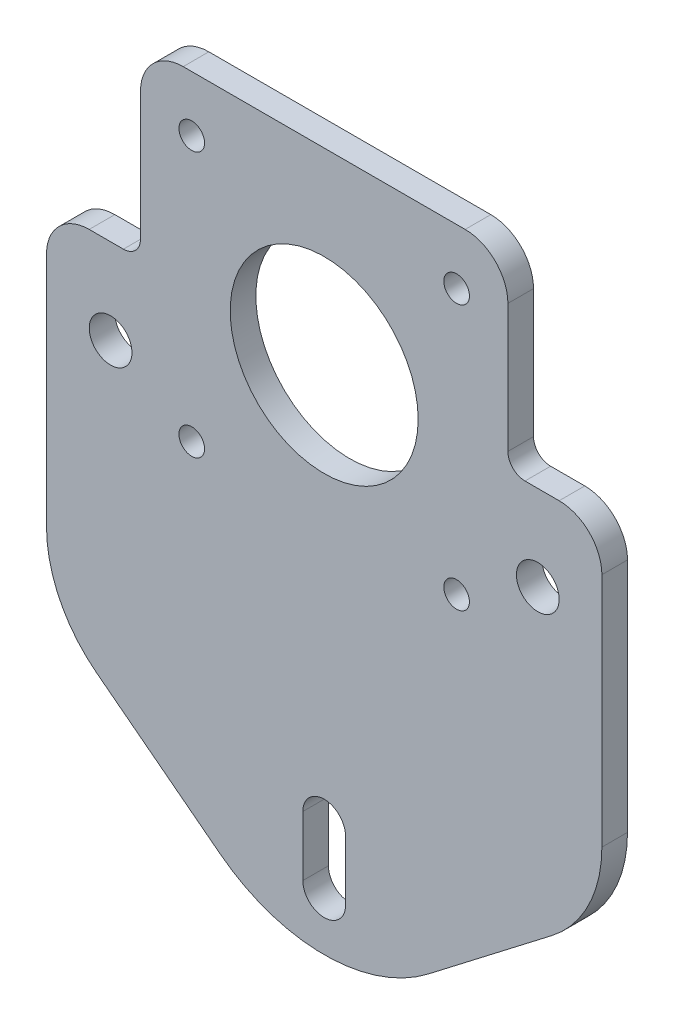
ISO-10303-21;
HEADER;
FILE_DESCRIPTION(('STEP AP214'),'2;1');
FILE_NAME('part.step','',(''),(''),'','','');
FILE_SCHEMA(('AUTOMOTIVE_DESIGN { 1 0 10303 214 1 1 1 1 }'));
ENDSEC;
DATA;
#1=APPLICATION_CONTEXT('core data for automotive mechanical design processes');
#2=APPLICATION_PROTOCOL_DEFINITION('international standard','automotive_design',2000,#1);
#3=PRODUCT_CONTEXT('',#1,'mechanical');
#4=PRODUCT('Part','Part','',(#3));
#5=PRODUCT_RELATED_PRODUCT_CATEGORY('part','',(#4));
#6=PRODUCT_DEFINITION_FORMATION('','',#4);
#7=PRODUCT_DEFINITION_CONTEXT('part definition',#1,'design');
#8=PRODUCT_DEFINITION('design','',#6,#7);
#9=PRODUCT_DEFINITION_SHAPE('','',#8);
#10=(LENGTH_UNIT() NAMED_UNIT(*) SI_UNIT(.MILLI.,.METRE.));
#11=(NAMED_UNIT(*) PLANE_ANGLE_UNIT() SI_UNIT($,.RADIAN.));
#12=(NAMED_UNIT(*) SI_UNIT($,.STERADIAN.) SOLID_ANGLE_UNIT());
#13=UNCERTAINTY_MEASURE_WITH_UNIT(LENGTH_MEASURE(1.E-05),#10,'distance_accuracy_value','');
#14=(GEOMETRIC_REPRESENTATION_CONTEXT(3) GLOBAL_UNCERTAINTY_ASSIGNED_CONTEXT((#13)) GLOBAL_UNIT_ASSIGNED_CONTEXT((#10,
#11,#12)) REPRESENTATION_CONTEXT('',''));
#15=CARTESIAN_POINT('',(0.,0.,0.));
#16=DIRECTION('',(0.,0.,1.));
#17=DIRECTION('',(1.,0.,0.));
#18=AXIS2_PLACEMENT_3D('',#15,#16,#17);
#19=CARTESIAN_POINT('',(-32.5,30.,3.));
#20=DIRECTION('',(0.,-1.,0.));
#21=DIRECTION('',(0.,0.,-1.));
#22=AXIS2_PLACEMENT_3D('',#19,#20,#21);
#23=PLANE('',#22);
#24=DIRECTION('',(-1.,0.,0.));
#25=VECTOR('',#24,1.);
#26=CARTESIAN_POINT('',(-32.5,30.,3.));
#27=LINE('',#26,#25);
#28=CARTESIAN_POINT('',(-23.5,30.,3.));
#29=VERTEX_POINT('',#28);
#30=CARTESIAN_POINT('',(-27.5,30.,3.));
#31=VERTEX_POINT('',#30);
#32=EDGE_CURVE('E247',#29,#31,#27,.T.);
#33=ORIENTED_EDGE('',*,*,#32,.F.);
#34=DIRECTION('',(0.,0.,1.));
#35=VECTOR('',#34,1.);
#36=CARTESIAN_POINT('',(-23.5,30.,0.));
#37=LINE('',#36,#35);
#38=CARTESIAN_POINT('',(-23.5,30.,0.));
#39=VERTEX_POINT('',#38);
#40=EDGE_CURVE('E280',#29,#39,#37,.F.);
#41=ORIENTED_EDGE('',*,*,#40,.T.);
#42=DIRECTION('',(-1.,0.,0.));
#43=VECTOR('',#42,1.);
#44=CARTESIAN_POINT('',(-32.5,30.,0.));
#45=LINE('',#44,#43);
#46=CARTESIAN_POINT('',(-27.5,30.,0.));
#47=VERTEX_POINT('',#46);
#48=EDGE_CURVE('E263',#39,#47,#45,.T.);
#49=ORIENTED_EDGE('',*,*,#48,.T.);
#50=DIRECTION('',(0.,0.,-1.));
#51=VECTOR('',#50,1.);
#52=CARTESIAN_POINT('',(-27.5,30.,3.));
#53=LINE('',#52,#51);
#54=EDGE_CURVE('E278',#47,#31,#53,.F.);
#55=ORIENTED_EDGE('',*,*,#54,.T.);
#56=EDGE_LOOP('',(#33,#41,#49,#55));
#57=FACE_BOUND('',#56,.T.);
#58=ADVANCED_FACE('F36',(#57),#23,.F.);
#59=CARTESIAN_POINT('',(27.5,30.,0.));
#60=VERTEX_POINT('',#59);
#61=CARTESIAN_POINT('',(23.5,30.,0.));
#62=VERTEX_POINT('',#61);
#63=EDGE_CURVE('E264',#60,#62,#45,.T.);
#64=ORIENTED_EDGE('',*,*,#63,.T.);
#65=DIRECTION('',(0.,0.,1.));
#66=VECTOR('',#65,1.);
#67=CARTESIAN_POINT('',(23.5,30.,3.));
#68=LINE('',#67,#66);
#69=CARTESIAN_POINT('',(23.5,30.,3.));
#70=VERTEX_POINT('',#69);
#71=EDGE_CURVE('E285',#62,#70,#68,.T.);
#72=ORIENTED_EDGE('',*,*,#71,.T.);
#73=CARTESIAN_POINT('',(27.5,30.,3.));
#74=VERTEX_POINT('',#73);
#75=EDGE_CURVE('E249',#74,#70,#27,.T.);
#76=ORIENTED_EDGE('',*,*,#75,.F.);
#77=DIRECTION('',(0.,0.,-1.));
#78=VECTOR('',#77,1.);
#79=CARTESIAN_POINT('',(27.5,30.,3.));
#80=LINE('',#79,#78);
#81=EDGE_CURVE('E282',#74,#60,#80,.T.);
#82=ORIENTED_EDGE('',*,*,#81,.T.);
#83=EDGE_LOOP('',(#64,#72,#76,#82));
#84=FACE_BOUND('',#83,.T.);
#85=ADVANCED_FACE('F372',(#84),#23,.F.);
#86=CARTESIAN_POINT('',(0.,0.,3.));
#87=DIRECTION('',(0.,0.,1.));
#88=DIRECTION('',(1.,0.,0.));
#89=AXIS2_PLACEMENT_3D('',#86,#87,#88);
#90=PLANE('',#89);
#91=CARTESIAN_POINT('',(15.5,14.5,3.));
#92=DIRECTION('',(0.,0.,1.));
#93=DIRECTION('',(1.,0.,0.));
#94=AXIS2_PLACEMENT_3D('',#91,#92,#93);
#95=CIRCLE('',#94,1.5);
#96=CARTESIAN_POINT('',(17.,14.5,3.));
#97=VERTEX_POINT('',#96);
#98=EDGE_CURVE('E458',#97,#97,#95,.T.);
#99=ORIENTED_EDGE('',*,*,#98,.F.);
#100=EDGE_LOOP('',(#99));
#101=FACE_BOUND('',#100,.T.);
#102=CARTESIAN_POINT('',(-15.5,14.5,3.));
#103=DIRECTION('',(0.,0.,1.));
#104=DIRECTION('',(1.,0.,0.));
#105=AXIS2_PLACEMENT_3D('',#102,#103,#104);
#106=CIRCLE('',#105,1.5);
#107=CARTESIAN_POINT('',(-14.,14.5,3.));
#108=VERTEX_POINT('',#107);
#109=EDGE_CURVE('E452',#108,#108,#106,.T.);
#110=ORIENTED_EDGE('',*,*,#109,.F.);
#111=EDGE_LOOP('',(#110));
#112=FACE_BOUND('',#111,.T.);
#113=CARTESIAN_POINT('',(0.,30.,3.));
#114=DIRECTION('',(0.,0.,1.));
#115=DIRECTION('',(1.,0.,0.));
#116=AXIS2_PLACEMENT_3D('',#113,#114,#115);
#117=CIRCLE('',#116,11.);
#118=CARTESIAN_POINT('',(11.,30.,3.));
#119=VERTEX_POINT('',#118);
#120=EDGE_CURVE('E361',#119,#119,#117,.T.);
#121=ORIENTED_EDGE('',*,*,#120,.F.);
#122=EDGE_LOOP('',(#121));
#123=FACE_BOUND('',#122,.T.);
#124=CARTESIAN_POINT('',(25.,20.,3.));
#125=DIRECTION('',(0.,0.,1.));
#126=DIRECTION('',(1.,0.,0.));
#127=AXIS2_PLACEMENT_3D('',#124,#125,#126);
#128=CIRCLE('',#127,2.5);
#129=CARTESIAN_POINT('',(27.5,20.,3.));
#130=VERTEX_POINT('',#129);
#131=EDGE_CURVE('E238',#130,#130,#128,.T.);
#132=ORIENTED_EDGE('',*,*,#131,.F.);
#133=EDGE_LOOP('',(#132));
#134=FACE_BOUND('',#133,.T.);
#135=DIRECTION('',(0.792623989104599,-0.609710760849693,0.));
#136=VECTOR('',#135,1.);
#137=CARTESIAN_POINT('',(0.,-35.,3.));
#138=LINE('',#137,#136);
#139=CARTESIAN_POINT('',(-26.6456614127454,-14.5033373748112,3.));
#140=VERTEX_POINT('',#139);
#141=CARTESIAN_POINT('',(-12.1942152169939,-25.6198344484662,3.));
#142=VERTEX_POINT('',#141);
#143=EDGE_CURVE('E254',#140,#142,#138,.T.);
#144=ORIENTED_EDGE('',*,*,#143,.T.);
#145=CARTESIAN_POINT('',(0.,-9.76735466637425,3.));
#146=DIRECTION('',(0.,0.,1.));
#147=DIRECTION('',(1.,0.,0.));
#148=AXIS2_PLACEMENT_3D('',#145,#146,#147);
#149=CIRCLE('',#148,20.);
#150=CARTESIAN_POINT('',(12.1942152169939,-25.6198344484662,3.));
#151=VERTEX_POINT('',#150);
#152=EDGE_CURVE('E328',#142,#151,#149,.T.);
#153=ORIENTED_EDGE('',*,*,#152,.T.);
#154=DIRECTION('',(0.792623989104599,0.609710760849693,0.));
#155=VECTOR('',#154,1.);
#156=CARTESIAN_POINT('',(32.5,-9.99999999999994,3.));
#157=LINE('',#156,#155);
#158=CARTESIAN_POINT('',(26.6456614127454,-14.5033373748112,3.));
#159=VERTEX_POINT('',#158);
#160=EDGE_CURVE('E257',#151,#159,#157,.T.);
#161=ORIENTED_EDGE('',*,*,#160,.T.);
#162=CARTESIAN_POINT('',(17.5,-2.61397753824219,3.));
#163=DIRECTION('',(0.,0.,1.));
#164=DIRECTION('',(1.,0.,0.));
#165=AXIS2_PLACEMENT_3D('',#162,#163,#164);
#166=CIRCLE('',#165,15.);
#167=CARTESIAN_POINT('',(32.5,-2.61397753824219,3.));
#168=VERTEX_POINT('',#167);
#169=EDGE_CURVE('E326',#159,#168,#166,.T.);
#170=ORIENTED_EDGE('',*,*,#169,.T.);
#171=DIRECTION('',(0.,1.,0.));
#172=VECTOR('',#171,1.);
#173=CARTESIAN_POINT('',(32.5,30.,3.));
#174=LINE('',#173,#172);
#175=CARTESIAN_POINT('',(32.5,25.,3.));
#176=VERTEX_POINT('',#175);
#177=EDGE_CURVE('E244',#168,#176,#174,.T.);
#178=ORIENTED_EDGE('',*,*,#177,.T.);
#179=CARTESIAN_POINT('',(27.5,25.,3.));
#180=DIRECTION('',(0.,0.,1.));
#181=DIRECTION('',(1.,0.,0.));
#182=AXIS2_PLACEMENT_3D('',#179,#180,#181);
#183=CIRCLE('',#182,5.);
#184=EDGE_CURVE('E317',#176,#74,#183,.T.);
#185=ORIENTED_EDGE('',*,*,#184,.T.);
#186=ORIENTED_EDGE('',*,*,#75,.T.);
#187=CARTESIAN_POINT('',(23.5,32.,3.));
#188=DIRECTION('',(0.,0.,1.));
#189=DIRECTION('',(1.,0.,0.));
#190=AXIS2_PLACEMENT_3D('',#187,#188,#189);
#191=CIRCLE('',#190,2.);
#192=CARTESIAN_POINT('',(21.5,32.,3.));
#193=VERTEX_POINT('',#192);
#194=EDGE_CURVE('E44',#70,#193,#191,.F.);
#195=ORIENTED_EDGE('',*,*,#194,.T.);
#196=DIRECTION('',(0.,1.,0.));
#197=VECTOR('',#196,1.);
#198=CARTESIAN_POINT('',(21.5,0.,3.));
#199=LINE('',#198,#197);
#200=CARTESIAN_POINT('',(21.5,47.,3.));
#201=VERTEX_POINT('',#200);
#202=EDGE_CURVE('E350',#193,#201,#199,.T.);
#203=ORIENTED_EDGE('',*,*,#202,.T.);
#204=CARTESIAN_POINT('',(16.5,47.,3.));
#205=DIRECTION('',(0.,0.,1.));
#206=DIRECTION('',(1.,0.,0.));
#207=AXIS2_PLACEMENT_3D('',#204,#205,#206);
#208=CIRCLE('',#207,5.);
#209=CARTESIAN_POINT('',(16.5,52.,3.));
#210=VERTEX_POINT('',#209);
#211=EDGE_CURVE('E322',#201,#210,#208,.T.);
#212=ORIENTED_EDGE('',*,*,#211,.T.);
#213=DIRECTION('',(1.,0.,0.));
#214=VECTOR('',#213,1.);
#215=CARTESIAN_POINT('',(0.,52.,3.));
#216=LINE('',#215,#214);
#217=CARTESIAN_POINT('',(-16.5,52.,3.));
#218=VERTEX_POINT('',#217);
#219=EDGE_CURVE('E360',#218,#210,#216,.T.);
#220=ORIENTED_EDGE('',*,*,#219,.F.);
#221=CARTESIAN_POINT('',(-16.5,47.,3.));
#222=DIRECTION('',(0.,0.,1.));
#223=DIRECTION('',(1.,0.,0.));
#224=AXIS2_PLACEMENT_3D('',#221,#222,#223);
#225=CIRCLE('',#224,5.);
#226=CARTESIAN_POINT('',(-21.5,47.,3.));
#227=VERTEX_POINT('',#226);
#228=EDGE_CURVE('E320',#218,#227,#225,.T.);
#229=ORIENTED_EDGE('',*,*,#228,.T.);
#230=DIRECTION('',(0.,1.,0.));
#231=VECTOR('',#230,1.);
#232=CARTESIAN_POINT('',(-21.5,0.,3.));
#233=LINE('',#232,#231);
#234=CARTESIAN_POINT('',(-21.5,32.,3.));
#235=VERTEX_POINT('',#234);
#236=EDGE_CURVE('E450',#235,#227,#233,.T.);
#237=ORIENTED_EDGE('',*,*,#236,.F.);
#238=CARTESIAN_POINT('',(-23.5,32.,3.));
#239=DIRECTION('',(0.,0.,1.));
#240=DIRECTION('',(1.,0.,0.));
#241=AXIS2_PLACEMENT_3D('',#238,#239,#240);
#242=CIRCLE('',#241,2.);
#243=EDGE_CURVE('E344',#235,#29,#242,.F.);
#244=ORIENTED_EDGE('',*,*,#243,.T.);
#245=ORIENTED_EDGE('',*,*,#32,.T.);
#246=CARTESIAN_POINT('',(-27.5,25.,3.));
#247=DIRECTION('',(0.,0.,1.));
#248=DIRECTION('',(1.,0.,0.));
#249=AXIS2_PLACEMENT_3D('',#246,#247,#248);
#250=CIRCLE('',#249,5.);
#251=CARTESIAN_POINT('',(-32.5,25.,3.));
#252=VERTEX_POINT('',#251);
#253=EDGE_CURVE('E58',#31,#252,#250,.T.);
#254=ORIENTED_EDGE('',*,*,#253,.T.);
#255=DIRECTION('',(0.,-1.,0.));
#256=VECTOR('',#255,1.);
#257=CARTESIAN_POINT('',(-32.5,-9.99999999999994,3.));
#258=LINE('',#257,#256);
#259=CARTESIAN_POINT('',(-32.5,-2.61397753824219,3.));
#260=VERTEX_POINT('',#259);
#261=EDGE_CURVE('E252',#252,#260,#258,.T.);
#262=ORIENTED_EDGE('',*,*,#261,.T.);
#263=CARTESIAN_POINT('',(-17.5,-2.61397753824219,3.));
#264=DIRECTION('',(0.,0.,1.));
#265=DIRECTION('',(1.,0.,0.));
#266=AXIS2_PLACEMENT_3D('',#263,#264,#265);
#267=CIRCLE('',#266,15.);
#268=EDGE_CURVE('E324',#260,#140,#267,.T.);
#269=ORIENTED_EDGE('',*,*,#268,.T.);
#270=EDGE_LOOP('',(#144,#153,#161,#170,#178,#185,#186,#195,#203,#212,#220,#229,#237,#244,#245,
#254,#262,#269));
#271=FACE_BOUND('',#270,.T.);
#272=CARTESIAN_POINT('',(-25.,20.,3.));
#273=DIRECTION('',(0.,0.,1.));
#274=DIRECTION('',(1.,0.,0.));
#275=AXIS2_PLACEMENT_3D('',#272,#273,#274);
#276=CIRCLE('',#275,2.5);
#277=CARTESIAN_POINT('',(-22.5,20.,3.));
#278=VERTEX_POINT('',#277);
#279=EDGE_CURVE('E232',#278,#278,#276,.T.);
#280=ORIENTED_EDGE('',*,*,#279,.F.);
#281=EDGE_LOOP('',(#280));
#282=FACE_BOUND('',#281,.T.);
#283=DIRECTION('',(0.,-1.,0.));
#284=VECTOR('',#283,1.);
#285=CARTESIAN_POINT('',(-2.50000000000698,-16.5,3.));
#286=LINE('',#285,#284);
#287=CARTESIAN_POINT('',(-2.50000000000698,-16.5,3.));
#288=VERTEX_POINT('',#287);
#289=CARTESIAN_POINT('',(-2.50000000000698,-23.5,3.));
#290=VERTEX_POINT('',#289);
#291=EDGE_CURVE('E197',#288,#290,#286,.T.);
#292=ORIENTED_EDGE('',*,*,#291,.F.);
#293=CARTESIAN_POINT('',(-6.97987588455585E-12,-16.5000000000001,3.));
#294=DIRECTION('',(0.,0.,1.));
#295=DIRECTION('',(1.,0.,0.));
#296=AXIS2_PLACEMENT_3D('',#293,#294,#295);
#297=CIRCLE('',#296,2.5);
#298=CARTESIAN_POINT('',(2.49999999999302,-16.5,3.));
#299=VERTEX_POINT('',#298);
#300=EDGE_CURVE('E187',#299,#288,#297,.T.);
#301=ORIENTED_EDGE('',*,*,#300,.F.);
#302=DIRECTION('',(0.,1.,0.));
#303=VECTOR('',#302,1.);
#304=CARTESIAN_POINT('',(2.49999999999302,-16.5,3.));
#305=LINE('',#304,#303);
#306=CARTESIAN_POINT('',(2.49999999999302,-23.5,3.));
#307=VERTEX_POINT('',#306);
#308=EDGE_CURVE('E214',#307,#299,#305,.T.);
#309=ORIENTED_EDGE('',*,*,#308,.F.);
#310=CARTESIAN_POINT('',(-6.98116176369495E-12,-23.5,3.));
#311=DIRECTION('',(0.,0.,1.));
#312=DIRECTION('',(1.,0.,0.));
#313=AXIS2_PLACEMENT_3D('',#310,#311,#312);
#314=CIRCLE('',#313,2.5);
#315=EDGE_CURVE('E212',#290,#307,#314,.T.);
#316=ORIENTED_EDGE('',*,*,#315,.F.);
#317=EDGE_LOOP('',(#292,#301,#309,#316));
#318=FACE_BOUND('',#317,.T.);
#319=CARTESIAN_POINT('',(15.5,45.5,3.));
#320=DIRECTION('',(0.,0.,1.));
#321=DIRECTION('',(1.,0.,0.));
#322=AXIS2_PLACEMENT_3D('',#319,#320,#321);
#323=CIRCLE('',#322,1.5);
#324=CARTESIAN_POINT('',(17.,45.5,3.));
#325=VERTEX_POINT('',#324);
#326=EDGE_CURVE('E440',#325,#325,#323,.T.);
#327=ORIENTED_EDGE('',*,*,#326,.F.);
#328=EDGE_LOOP('',(#327));
#329=FACE_BOUND('',#328,.T.);
#330=CARTESIAN_POINT('',(-15.5,45.5,3.));
#331=DIRECTION('',(0.,0.,1.));
#332=DIRECTION('',(1.,0.,0.));
#333=AXIS2_PLACEMENT_3D('',#330,#331,#332);
#334=CIRCLE('',#333,1.5);
#335=CARTESIAN_POINT('',(-14.,45.5,3.));
#336=VERTEX_POINT('',#335);
#337=EDGE_CURVE('E443',#336,#336,#334,.T.);
#338=ORIENTED_EDGE('',*,*,#337,.F.);
#339=EDGE_LOOP('',(#338));
#340=FACE_BOUND('',#339,.T.);
#341=ADVANCED_FACE('F209',(#101,#112,#123,#134,#271,#282,#318,#329,#340),#90,.T.);
#342=CARTESIAN_POINT('',(0.,0.,0.));
#343=DIRECTION('',(0.,0.,1.));
#344=DIRECTION('',(1.,0.,0.));
#345=AXIS2_PLACEMENT_3D('',#342,#343,#344);
#346=PLANE('',#345);
#347=CARTESIAN_POINT('',(15.5,14.5,0.));
#348=DIRECTION('',(0.,0.,1.));
#349=DIRECTION('',(1.,0.,0.));
#350=AXIS2_PLACEMENT_3D('',#347,#348,#349);
#351=CIRCLE('',#350,1.5);
#352=CARTESIAN_POINT('',(17.,14.5,0.));
#353=VERTEX_POINT('',#352);
#354=EDGE_CURVE('E444',#353,#353,#351,.T.);
#355=ORIENTED_EDGE('',*,*,#354,.T.);
#356=EDGE_LOOP('',(#355));
#357=FACE_BOUND('',#356,.T.);
#358=CARTESIAN_POINT('',(-15.5,14.5,0.));
#359=DIRECTION('',(0.,0.,1.));
#360=DIRECTION('',(1.,0.,0.));
#361=AXIS2_PLACEMENT_3D('',#358,#359,#360);
#362=CIRCLE('',#361,1.5);
#363=CARTESIAN_POINT('',(-14.,14.5,0.));
#364=VERTEX_POINT('',#363);
#365=EDGE_CURVE('E455',#364,#364,#362,.T.);
#366=ORIENTED_EDGE('',*,*,#365,.T.);
#367=EDGE_LOOP('',(#366));
#368=FACE_BOUND('',#367,.T.);
#369=DIRECTION('',(0.792623989104599,0.609710760849693,0.));
#370=VECTOR('',#369,1.);
#371=CARTESIAN_POINT('',(32.5,-9.99999999999994,0.));
#372=LINE('',#371,#370);
#373=CARTESIAN_POINT('',(12.1942152169939,-25.6198344484662,0.));
#374=VERTEX_POINT('',#373);
#375=CARTESIAN_POINT('',(26.6456614127454,-14.5033373748112,0.));
#376=VERTEX_POINT('',#375);
#377=EDGE_CURVE('E248',#374,#376,#372,.T.);
#378=ORIENTED_EDGE('',*,*,#377,.F.);
#379=CARTESIAN_POINT('',(0.,-9.76735466637425,0.));
#380=DIRECTION('',(0.,0.,1.));
#381=DIRECTION('',(1.,0.,0.));
#382=AXIS2_PLACEMENT_3D('',#379,#380,#381);
#383=CIRCLE('',#382,20.);
#384=CARTESIAN_POINT('',(-12.1942152169939,-25.6198344484662,0.));
#385=VERTEX_POINT('',#384);
#386=EDGE_CURVE('E310',#374,#385,#383,.F.);
#387=ORIENTED_EDGE('',*,*,#386,.T.);
#388=DIRECTION('',(0.792623989104599,-0.609710760849693,0.));
#389=VECTOR('',#388,1.);
#390=CARTESIAN_POINT('',(0.,-35.,0.));
#391=LINE('',#390,#389);
#392=CARTESIAN_POINT('',(-26.6456614127454,-14.5033373748112,0.));
#393=VERTEX_POINT('',#392);
#394=EDGE_CURVE('E269',#393,#385,#391,.T.);
#395=ORIENTED_EDGE('',*,*,#394,.F.);
#396=CARTESIAN_POINT('',(-17.5,-2.61397753824219,0.));
#397=DIRECTION('',(0.,0.,1.));
#398=DIRECTION('',(1.,0.,0.));
#399=AXIS2_PLACEMENT_3D('',#396,#397,#398);
#400=CIRCLE('',#399,15.);
#401=CARTESIAN_POINT('',(-32.5,-2.61397753824219,0.));
#402=VERTEX_POINT('',#401);
#403=EDGE_CURVE('E306',#393,#402,#400,.F.);
#404=ORIENTED_EDGE('',*,*,#403,.T.);
#405=DIRECTION('',(0.,-1.,0.));
#406=VECTOR('',#405,1.);
#407=CARTESIAN_POINT('',(-32.5,-9.99999999999994,0.));
#408=LINE('',#407,#406);
#409=CARTESIAN_POINT('',(-32.5,25.,0.));
#410=VERTEX_POINT('',#409);
#411=EDGE_CURVE('E267',#410,#402,#408,.T.);
#412=ORIENTED_EDGE('',*,*,#411,.F.);
#413=CARTESIAN_POINT('',(-27.5,25.,0.));
#414=DIRECTION('',(0.,0.,1.));
#415=DIRECTION('',(1.,0.,0.));
#416=AXIS2_PLACEMENT_3D('',#413,#414,#415);
#417=CIRCLE('',#416,5.);
#418=EDGE_CURVE('E300',#410,#47,#417,.F.);
#419=ORIENTED_EDGE('',*,*,#418,.T.);
#420=ORIENTED_EDGE('',*,*,#48,.F.);
#421=CARTESIAN_POINT('',(-23.5,32.,0.));
#422=DIRECTION('',(0.,0.,1.));
#423=DIRECTION('',(1.,0.,0.));
#424=AXIS2_PLACEMENT_3D('',#421,#422,#423);
#425=CIRCLE('',#424,2.);
#426=CARTESIAN_POINT('',(-21.5,32.,0.));
#427=VERTEX_POINT('',#426);
#428=EDGE_CURVE('E346',#39,#427,#425,.T.);
#429=ORIENTED_EDGE('',*,*,#428,.T.);
#430=DIRECTION('',(0.,-1.,0.));
#431=VECTOR('',#430,1.);
#432=CARTESIAN_POINT('',(-21.5,0.,0.));
#433=LINE('',#432,#431);
#434=CARTESIAN_POINT('',(-21.5,47.,0.));
#435=VERTEX_POINT('',#434);
#436=EDGE_CURVE('E419',#435,#427,#433,.T.);
#437=ORIENTED_EDGE('',*,*,#436,.F.);
#438=CARTESIAN_POINT('',(-16.5,47.,0.));
#439=DIRECTION('',(0.,0.,1.));
#440=DIRECTION('',(1.,0.,0.));
#441=AXIS2_PLACEMENT_3D('',#438,#439,#440);
#442=CIRCLE('',#441,5.);
#443=CARTESIAN_POINT('',(-16.5,52.,0.));
#444=VERTEX_POINT('',#443);
#445=EDGE_CURVE('E302',#435,#444,#442,.F.);
#446=ORIENTED_EDGE('',*,*,#445,.T.);
#447=DIRECTION('',(-1.,0.,0.));
#448=VECTOR('',#447,1.);
#449=CARTESIAN_POINT('',(0.,52.,0.));
#450=LINE('',#449,#448);
#451=CARTESIAN_POINT('',(16.5,52.,0.));
#452=VERTEX_POINT('',#451);
#453=EDGE_CURVE('E427',#452,#444,#450,.T.);
#454=ORIENTED_EDGE('',*,*,#453,.F.);
#455=CARTESIAN_POINT('',(16.5,47.,0.));
#456=DIRECTION('',(0.,0.,1.));
#457=DIRECTION('',(1.,0.,0.));
#458=AXIS2_PLACEMENT_3D('',#455,#456,#457);
#459=CIRCLE('',#458,5.);
#460=CARTESIAN_POINT('',(21.5,47.,0.));
#461=VERTEX_POINT('',#460);
#462=EDGE_CURVE('E304',#452,#461,#459,.F.);
#463=ORIENTED_EDGE('',*,*,#462,.T.);
#464=DIRECTION('',(0.,-1.,0.));
#465=VECTOR('',#464,1.);
#466=CARTESIAN_POINT('',(21.5,0.,0.));
#467=LINE('',#466,#465);
#468=CARTESIAN_POINT('',(21.5,32.,0.));
#469=VERTEX_POINT('',#468);
#470=EDGE_CURVE('E370',#461,#469,#467,.T.);
#471=ORIENTED_EDGE('',*,*,#470,.T.);
#472=CARTESIAN_POINT('',(23.5,32.,0.));
#473=DIRECTION('',(0.,0.,1.));
#474=DIRECTION('',(1.,0.,0.));
#475=AXIS2_PLACEMENT_3D('',#472,#473,#474);
#476=CIRCLE('',#475,2.);
#477=EDGE_CURVE('E12',#469,#62,#476,.T.);
#478=ORIENTED_EDGE('',*,*,#477,.T.);
#479=ORIENTED_EDGE('',*,*,#63,.F.);
#480=CARTESIAN_POINT('',(27.5,25.,0.));
#481=DIRECTION('',(0.,0.,1.));
#482=DIRECTION('',(1.,0.,0.));
#483=AXIS2_PLACEMENT_3D('',#480,#481,#482);
#484=CIRCLE('',#483,5.);
#485=CARTESIAN_POINT('',(32.5,25.,0.));
#486=VERTEX_POINT('',#485);
#487=EDGE_CURVE('E298',#60,#486,#484,.F.);
#488=ORIENTED_EDGE('',*,*,#487,.T.);
#489=DIRECTION('',(0.,1.,0.));
#490=VECTOR('',#489,1.);
#491=CARTESIAN_POINT('',(32.5,30.,0.));
#492=LINE('',#491,#490);
#493=CARTESIAN_POINT('',(32.5,-2.61397753824219,0.));
#494=VERTEX_POINT('',#493);
#495=EDGE_CURVE('E241',#494,#486,#492,.T.);
#496=ORIENTED_EDGE('',*,*,#495,.F.);
#497=CARTESIAN_POINT('',(17.5,-2.61397753824219,0.));
#498=DIRECTION('',(0.,0.,1.));
#499=DIRECTION('',(1.,0.,0.));
#500=AXIS2_PLACEMENT_3D('',#497,#498,#499);
#501=CIRCLE('',#500,15.);
#502=EDGE_CURVE('E308',#494,#376,#501,.F.);
#503=ORIENTED_EDGE('',*,*,#502,.T.);
#504=EDGE_LOOP('',(#378,#387,#395,#404,#412,#419,#420,#429,#437,#446,#454,#463,#471,#478,#479,
#488,#496,#503));
#505=FACE_BOUND('',#504,.T.);
#506=CARTESIAN_POINT('',(-25.,20.,0.));
#507=DIRECTION('',(0.,0.,1.));
#508=DIRECTION('',(1.,0.,0.));
#509=AXIS2_PLACEMENT_3D('',#506,#507,#508);
#510=CIRCLE('',#509,2.5);
#511=CARTESIAN_POINT('',(-22.5,20.,0.));
#512=VERTEX_POINT('',#511);
#513=EDGE_CURVE('E205',#512,#512,#510,.T.);
#514=ORIENTED_EDGE('',*,*,#513,.T.);
#515=EDGE_LOOP('',(#514));
#516=FACE_BOUND('',#515,.T.);
#517=CARTESIAN_POINT('',(25.,20.,0.));
#518=DIRECTION('',(0.,0.,1.));
#519=DIRECTION('',(1.,0.,0.));
#520=AXIS2_PLACEMENT_3D('',#517,#518,#519);
#521=CIRCLE('',#520,2.5);
#522=CARTESIAN_POINT('',(27.5,20.,0.));
#523=VERTEX_POINT('',#522);
#524=EDGE_CURVE('E235',#523,#523,#521,.T.);
#525=ORIENTED_EDGE('',*,*,#524,.T.);
#526=EDGE_LOOP('',(#525));
#527=FACE_BOUND('',#526,.T.);
#528=CARTESIAN_POINT('',(0.,30.,0.));
#529=DIRECTION('',(0.,0.,1.));
#530=DIRECTION('',(1.,0.,0.));
#531=AXIS2_PLACEMENT_3D('',#528,#529,#530);
#532=CIRCLE('',#531,11.);
#533=CARTESIAN_POINT('',(11.,30.,0.));
#534=VERTEX_POINT('',#533);
#535=EDGE_CURVE('E426',#534,#534,#532,.F.);
#536=ORIENTED_EDGE('',*,*,#535,.F.);
#537=EDGE_LOOP('',(#536));
#538=FACE_BOUND('',#537,.T.);
#539=CARTESIAN_POINT('',(-6.97987588455585E-12,-16.5000000000001,0.));
#540=DIRECTION('',(0.,0.,1.));
#541=DIRECTION('',(1.,0.,0.));
#542=AXIS2_PLACEMENT_3D('',#539,#540,#541);
#543=CIRCLE('',#542,2.5);
#544=CARTESIAN_POINT('',(2.49999999999302,-16.5,0.));
#545=VERTEX_POINT('',#544);
#546=CARTESIAN_POINT('',(-2.50000000000698,-16.5,0.));
#547=VERTEX_POINT('',#546);
#548=EDGE_CURVE('E219',#545,#547,#543,.T.);
#549=ORIENTED_EDGE('',*,*,#548,.T.);
#550=DIRECTION('',(0.,-1.,0.));
#551=VECTOR('',#550,1.);
#552=CARTESIAN_POINT('',(-2.50000000000698,-16.5,0.));
#553=LINE('',#552,#551);
#554=CARTESIAN_POINT('',(-2.50000000000698,-23.5,0.));
#555=VERTEX_POINT('',#554);
#556=EDGE_CURVE('E204',#547,#555,#553,.T.);
#557=ORIENTED_EDGE('',*,*,#556,.T.);
#558=CARTESIAN_POINT('',(-6.98116176369495E-12,-23.5,0.));
#559=DIRECTION('',(0.,0.,1.));
#560=DIRECTION('',(1.,0.,0.));
#561=AXIS2_PLACEMENT_3D('',#558,#559,#560);
#562=CIRCLE('',#561,2.5);
#563=CARTESIAN_POINT('',(2.49999999999302,-23.5,0.));
#564=VERTEX_POINT('',#563);
#565=EDGE_CURVE('E223',#555,#564,#562,.T.);
#566=ORIENTED_EDGE('',*,*,#565,.T.);
#567=DIRECTION('',(0.,1.,0.));
#568=VECTOR('',#567,1.);
#569=CARTESIAN_POINT('',(2.49999999999302,-16.5,0.));
#570=LINE('',#569,#568);
#571=EDGE_CURVE('E198',#564,#545,#570,.T.);
#572=ORIENTED_EDGE('',*,*,#571,.T.);
#573=EDGE_LOOP('',(#549,#557,#566,#572));
#574=FACE_BOUND('',#573,.T.);
#575=CARTESIAN_POINT('',(15.5,45.5,0.));
#576=DIRECTION('',(0.,0.,1.));
#577=DIRECTION('',(1.,0.,0.));
#578=AXIS2_PLACEMENT_3D('',#575,#576,#577);
#579=CIRCLE('',#578,1.5);
#580=CARTESIAN_POINT('',(17.,45.5,0.));
#581=VERTEX_POINT('',#580);
#582=EDGE_CURVE('E430',#581,#581,#579,.F.);
#583=ORIENTED_EDGE('',*,*,#582,.F.);
#584=EDGE_LOOP('',(#583));
#585=FACE_BOUND('',#584,.T.);
#586=CARTESIAN_POINT('',(-15.5,45.5,0.));
#587=DIRECTION('',(0.,0.,1.));
#588=DIRECTION('',(1.,0.,0.));
#589=AXIS2_PLACEMENT_3D('',#586,#587,#588);
#590=CIRCLE('',#589,1.5);
#591=CARTESIAN_POINT('',(-14.,45.5,0.));
#592=VERTEX_POINT('',#591);
#593=EDGE_CURVE('E221',#592,#592,#590,.F.);
#594=ORIENTED_EDGE('',*,*,#593,.F.);
#595=EDGE_LOOP('',(#594));
#596=FACE_BOUND('',#595,.T.);
#597=ADVANCED_FACE('F368',(#357,#368,#505,#516,#527,#538,#574,#585,#596),#346,.F.);
#598=CARTESIAN_POINT('',(32.5,30.,3.));
#599=DIRECTION('',(-1.,0.,0.));
#600=DIRECTION('',(0.,0.,1.));
#601=AXIS2_PLACEMENT_3D('',#598,#599,#600);
#602=PLANE('',#601);
#603=ORIENTED_EDGE('',*,*,#177,.F.);
#604=DIRECTION('',(0.,0.,-1.));
#605=VECTOR('',#604,1.);
#606=CARTESIAN_POINT('',(32.5,-2.61397753824219,3.));
#607=LINE('',#606,#605);
#608=EDGE_CURVE('E332',#168,#494,#607,.T.);
#609=ORIENTED_EDGE('',*,*,#608,.T.);
#610=ORIENTED_EDGE('',*,*,#495,.T.);
#611=DIRECTION('',(0.,0.,-1.));
#612=VECTOR('',#611,1.);
#613=CARTESIAN_POINT('',(32.5,25.,3.));
#614=LINE('',#613,#612);
#615=EDGE_CURVE('E330',#486,#176,#614,.F.);
#616=ORIENTED_EDGE('',*,*,#615,.T.);
#617=EDGE_LOOP('',(#603,#609,#610,#616));
#618=FACE_BOUND('',#617,.T.);
#619=ADVANCED_FACE('F380',(#618),#602,.F.);
#620=CARTESIAN_POINT('',(-32.5,-9.99999999999994,3.));
#621=DIRECTION('',(1.,0.,0.));
#622=DIRECTION('',(0.,0.,-1.));
#623=AXIS2_PLACEMENT_3D('',#620,#621,#622);
#624=PLANE('',#623);
#625=ORIENTED_EDGE('',*,*,#411,.T.);
#626=DIRECTION('',(0.,0.,-1.));
#627=VECTOR('',#626,1.);
#628=CARTESIAN_POINT('',(-32.5,-2.61397753824219,3.));
#629=LINE('',#628,#627);
#630=EDGE_CURVE('E51',#402,#260,#629,.F.);
#631=ORIENTED_EDGE('',*,*,#630,.T.);
#632=ORIENTED_EDGE('',*,*,#261,.F.);
#633=DIRECTION('',(0.,0.,-1.));
#634=VECTOR('',#633,1.);
#635=CARTESIAN_POINT('',(-32.5,25.,3.));
#636=LINE('',#635,#634);
#637=EDGE_CURVE('E335',#252,#410,#636,.T.);
#638=ORIENTED_EDGE('',*,*,#637,.T.);
#639=EDGE_LOOP('',(#625,#631,#632,#638));
#640=FACE_BOUND('',#639,.T.);
#641=ADVANCED_FACE('F403',(#640),#624,.F.);
#642=CARTESIAN_POINT('',(0.,-35.,3.));
#643=DIRECTION('',(0.609710760849693,0.792623989104599,0.));
#644=DIRECTION('',(-0.792623989104599,0.609710760849693,0.));
#645=AXIS2_PLACEMENT_3D('',#642,#643,#644);
#646=PLANE('',#645);
#647=ORIENTED_EDGE('',*,*,#394,.T.);
#648=DIRECTION('',(0.,0.,-1.));
#649=VECTOR('',#648,1.);
#650=CARTESIAN_POINT('',(-12.1942152169939,-25.6198344484662,3.));
#651=LINE('',#650,#649);
#652=EDGE_CURVE('E315',#385,#142,#651,.F.);
#653=ORIENTED_EDGE('',*,*,#652,.T.);
#654=ORIENTED_EDGE('',*,*,#143,.F.);
#655=DIRECTION('',(0.,0.,-1.));
#656=VECTOR('',#655,1.);
#657=CARTESIAN_POINT('',(-26.6456614127454,-14.5033373748112,3.));
#658=LINE('',#657,#656);
#659=EDGE_CURVE('E312',#140,#393,#658,.T.);
#660=ORIENTED_EDGE('',*,*,#659,.T.);
#661=EDGE_LOOP('',(#647,#653,#654,#660));
#662=FACE_BOUND('',#661,.T.);
#663=ADVANCED_FACE('F396',(#662),#646,.F.);
#664=CARTESIAN_POINT('',(32.5,-9.99999999999994,3.));
#665=DIRECTION('',(-0.609710760849693,0.792623989104599,0.));
#666=DIRECTION('',(-0.792623989104599,-0.609710760849693,0.));
#667=AXIS2_PLACEMENT_3D('',#664,#665,#666);
#668=PLANE('',#667);
#669=ORIENTED_EDGE('',*,*,#160,.F.);
#670=DIRECTION('',(0.,0.,-1.));
#671=VECTOR('',#670,1.);
#672=CARTESIAN_POINT('',(12.1942152169939,-25.6198344484662,3.));
#673=LINE('',#672,#671);
#674=EDGE_CURVE('E295',#151,#374,#673,.T.);
#675=ORIENTED_EDGE('',*,*,#674,.T.);
#676=ORIENTED_EDGE('',*,*,#377,.T.);
#677=DIRECTION('',(0.,0.,-1.));
#678=VECTOR('',#677,1.);
#679=CARTESIAN_POINT('',(26.6456614127454,-14.5033373748112,3.));
#680=LINE('',#679,#678);
#681=EDGE_CURVE('E293',#376,#159,#680,.F.);
#682=ORIENTED_EDGE('',*,*,#681,.T.);
#683=EDGE_LOOP('',(#669,#675,#676,#682));
#684=FACE_BOUND('',#683,.T.);
#685=ADVANCED_FACE('F388',(#684),#668,.F.);
#686=CARTESIAN_POINT('',(25.,20.,3.));
#687=DIRECTION('',(0.,0.,-1.));
#688=DIRECTION('',(-1.,0.,0.));
#689=AXIS2_PLACEMENT_3D('',#686,#687,#688);
#690=CYLINDRICAL_SURFACE('',#689,2.5);
#691=ORIENTED_EDGE('',*,*,#131,.T.);
#692=EDGE_LOOP('',(#691));
#693=FACE_BOUND('',#692,.T.);
#694=ORIENTED_EDGE('',*,*,#524,.F.);
#695=EDGE_LOOP('',(#694));
#696=FACE_BOUND('',#695,.T.);
#697=ADVANCED_FACE('F482',(#693,#696),#690,.F.);
#698=CARTESIAN_POINT('',(-25.,20.,3.));
#699=DIRECTION('',(0.,0.,-1.));
#700=DIRECTION('',(-1.,0.,0.));
#701=AXIS2_PLACEMENT_3D('',#698,#699,#700);
#702=CYLINDRICAL_SURFACE('',#701,2.5);
#703=ORIENTED_EDGE('',*,*,#279,.T.);
#704=EDGE_LOOP('',(#703));
#705=FACE_BOUND('',#704,.T.);
#706=ORIENTED_EDGE('',*,*,#513,.F.);
#707=EDGE_LOOP('',(#706));
#708=FACE_BOUND('',#707,.T.);
#709=ADVANCED_FACE('F485',(#705,#708),#702,.F.);
#710=CARTESIAN_POINT('',(-6.97987588455585E-12,-16.5000000000001,3.));
#711=DIRECTION('',(0.,0.,-1.));
#712=DIRECTION('',(-1.,0.,0.));
#713=AXIS2_PLACEMENT_3D('',#710,#711,#712);
#714=CYLINDRICAL_SURFACE('',#713,2.5);
#715=ORIENTED_EDGE('',*,*,#548,.F.);
#716=DIRECTION('',(0.,0.,-1.));
#717=VECTOR('',#716,1.);
#718=CARTESIAN_POINT('',(2.49999999999302,-16.5,3.));
#719=LINE('',#718,#717);
#720=EDGE_CURVE('E193',#299,#545,#719,.T.);
#721=ORIENTED_EDGE('',*,*,#720,.F.);
#722=ORIENTED_EDGE('',*,*,#300,.T.);
#723=DIRECTION('',(0.,0.,-1.));
#724=VECTOR('',#723,1.);
#725=CARTESIAN_POINT('',(-2.50000000000698,-16.5,3.));
#726=LINE('',#725,#724);
#727=EDGE_CURVE('E190',#288,#547,#726,.T.);
#728=ORIENTED_EDGE('',*,*,#727,.T.);
#729=EDGE_LOOP('',(#715,#721,#722,#728));
#730=FACE_BOUND('',#729,.T.);
#731=ADVANCED_FACE('F189',(#730),#714,.F.);
#732=CARTESIAN_POINT('',(-2.50000000000698,-16.5,3.));
#733=DIRECTION('',(1.,0.,0.));
#734=DIRECTION('',(0.,1.,0.));
#735=AXIS2_PLACEMENT_3D('',#732,#733,#734);
#736=PLANE('',#735);
#737=ORIENTED_EDGE('',*,*,#556,.F.);
#738=ORIENTED_EDGE('',*,*,#727,.F.);
#739=ORIENTED_EDGE('',*,*,#291,.T.);
#740=DIRECTION('',(0.,0.,-1.));
#741=VECTOR('',#740,1.);
#742=CARTESIAN_POINT('',(-2.50000000000698,-23.5,3.));
#743=LINE('',#742,#741);
#744=EDGE_CURVE('E206',#290,#555,#743,.T.);
#745=ORIENTED_EDGE('',*,*,#744,.T.);
#746=EDGE_LOOP('',(#737,#738,#739,#745));
#747=FACE_BOUND('',#746,.T.);
#748=ADVANCED_FACE('F201',(#747),#736,.T.);
#749=CARTESIAN_POINT('',(-6.98116176369495E-12,-23.5,3.));
#750=DIRECTION('',(0.,0.,-1.));
#751=DIRECTION('',(-1.,0.,0.));
#752=AXIS2_PLACEMENT_3D('',#749,#750,#751);
#753=CYLINDRICAL_SURFACE('',#752,2.5);
#754=ORIENTED_EDGE('',*,*,#565,.F.);
#755=ORIENTED_EDGE('',*,*,#744,.F.);
#756=ORIENTED_EDGE('',*,*,#315,.T.);
#757=DIRECTION('',(0.,0.,-1.));
#758=VECTOR('',#757,1.);
#759=CARTESIAN_POINT('',(2.49999999999302,-23.5,3.));
#760=LINE('',#759,#758);
#761=EDGE_CURVE('E229',#307,#564,#760,.T.);
#762=ORIENTED_EDGE('',*,*,#761,.T.);
#763=EDGE_LOOP('',(#754,#755,#756,#762));
#764=FACE_BOUND('',#763,.T.);
#765=ADVANCED_FACE('F513',(#764),#753,.F.);
#766=CARTESIAN_POINT('',(2.49999999999302,-16.5,3.));
#767=DIRECTION('',(-1.,0.,0.));
#768=DIRECTION('',(0.,-1.,0.));
#769=AXIS2_PLACEMENT_3D('',#766,#767,#768);
#770=PLANE('',#769);
#771=ORIENTED_EDGE('',*,*,#571,.F.);
#772=ORIENTED_EDGE('',*,*,#761,.F.);
#773=ORIENTED_EDGE('',*,*,#308,.T.);
#774=ORIENTED_EDGE('',*,*,#720,.T.);
#775=EDGE_LOOP('',(#771,#772,#773,#774));
#776=FACE_BOUND('',#775,.T.);
#777=ADVANCED_FACE('F503',(#776),#770,.T.);
#778=CARTESIAN_POINT('',(-15.5,45.5,-48.3011387029333));
#779=DIRECTION('',(0.,0.,1.));
#780=DIRECTION('',(1.,0.,0.));
#781=AXIS2_PLACEMENT_3D('',#778,#779,#780);
#782=CYLINDRICAL_SURFACE('',#781,1.5);
#783=ORIENTED_EDGE('',*,*,#593,.T.);
#784=EDGE_LOOP('',(#783));
#785=FACE_BOUND('',#784,.T.);
#786=ORIENTED_EDGE('',*,*,#337,.T.);
#787=EDGE_LOOP('',(#786));
#788=FACE_BOUND('',#787,.T.);
#789=ADVANCED_FACE('F499',(#785,#788),#782,.F.);
#790=CARTESIAN_POINT('',(15.5,45.5,-48.3011387029333));
#791=DIRECTION('',(0.,0.,1.));
#792=DIRECTION('',(1.,0.,0.));
#793=AXIS2_PLACEMENT_3D('',#790,#791,#792);
#794=CYLINDRICAL_SURFACE('',#793,1.5);
#795=ORIENTED_EDGE('',*,*,#582,.T.);
#796=EDGE_LOOP('',(#795));
#797=FACE_BOUND('',#796,.T.);
#798=ORIENTED_EDGE('',*,*,#326,.T.);
#799=EDGE_LOOP('',(#798));
#800=FACE_BOUND('',#799,.T.);
#801=ADVANCED_FACE('F502',(#797,#800),#794,.F.);
#802=CARTESIAN_POINT('',(21.5,0.,-48.3011387029333));
#803=DIRECTION('',(1.,0.,0.));
#804=DIRECTION('',(0.,0.,-1.));
#805=AXIS2_PLACEMENT_3D('',#802,#803,#804);
#806=PLANE('',#805);
#807=ORIENTED_EDGE('',*,*,#202,.F.);
#808=DIRECTION('',(0.,0.,1.));
#809=VECTOR('',#808,1.);
#810=CARTESIAN_POINT('',(21.5,32.,-48.3011387029333));
#811=LINE('',#810,#809);
#812=EDGE_CURVE('E291',#193,#469,#811,.F.);
#813=ORIENTED_EDGE('',*,*,#812,.T.);
#814=ORIENTED_EDGE('',*,*,#470,.F.);
#815=DIRECTION('',(0.,0.,1.));
#816=VECTOR('',#815,1.);
#817=CARTESIAN_POINT('',(21.5,47.,3.));
#818=LINE('',#817,#816);
#819=EDGE_CURVE('E288',#461,#201,#818,.T.);
#820=ORIENTED_EDGE('',*,*,#819,.T.);
#821=EDGE_LOOP('',(#807,#813,#814,#820));
#822=FACE_BOUND('',#821,.T.);
#823=ADVANCED_FACE('F356',(#822),#806,.T.);
#824=CARTESIAN_POINT('',(0.,52.,-48.3011387029333));
#825=DIRECTION('',(0.,-1.,0.));
#826=DIRECTION('',(0.,0.,-1.));
#827=AXIS2_PLACEMENT_3D('',#824,#825,#826);
#828=PLANE('',#827);
#829=ORIENTED_EDGE('',*,*,#219,.T.);
#830=DIRECTION('',(0.,0.,1.));
#831=VECTOR('',#830,1.);
#832=CARTESIAN_POINT('',(16.5,52.,0.));
#833=LINE('',#832,#831);
#834=EDGE_CURVE('E342',#210,#452,#833,.F.);
#835=ORIENTED_EDGE('',*,*,#834,.T.);
#836=ORIENTED_EDGE('',*,*,#453,.T.);
#837=DIRECTION('',(0.,0.,1.));
#838=VECTOR('',#837,1.);
#839=CARTESIAN_POINT('',(-16.5,52.,-48.3011387029333));
#840=LINE('',#839,#838);
#841=EDGE_CURVE('E339',#444,#218,#840,.T.);
#842=ORIENTED_EDGE('',*,*,#841,.T.);
#843=EDGE_LOOP('',(#829,#835,#836,#842));
#844=FACE_BOUND('',#843,.T.);
#845=ADVANCED_FACE('F561',(#844),#828,.F.);
#846=CARTESIAN_POINT('',(-21.5,0.,-48.3011387029333));
#847=DIRECTION('',(1.,0.,0.));
#848=DIRECTION('',(0.,0.,-1.));
#849=AXIS2_PLACEMENT_3D('',#846,#847,#848);
#850=PLANE('',#849);
#851=ORIENTED_EDGE('',*,*,#436,.T.);
#852=DIRECTION('',(0.,0.,1.));
#853=VECTOR('',#852,1.);
#854=CARTESIAN_POINT('',(-21.5,32.,3.));
#855=LINE('',#854,#853);
#856=EDGE_CURVE('E275',#427,#235,#855,.T.);
#857=ORIENTED_EDGE('',*,*,#856,.T.);
#858=ORIENTED_EDGE('',*,*,#236,.T.);
#859=DIRECTION('',(0.,0.,1.));
#860=VECTOR('',#859,1.);
#861=CARTESIAN_POINT('',(-21.5,47.,-48.3011387029333));
#862=LINE('',#861,#860);
#863=EDGE_CURVE('E260',#227,#435,#862,.F.);
#864=ORIENTED_EDGE('',*,*,#863,.T.);
#865=EDGE_LOOP('',(#851,#857,#858,#864));
#866=FACE_BOUND('',#865,.T.);
#867=ADVANCED_FACE('F422',(#866),#850,.F.);
#868=CARTESIAN_POINT('',(0.,30.,-48.3011387029333));
#869=DIRECTION('',(0.,0.,1.));
#870=DIRECTION('',(1.,0.,0.));
#871=AXIS2_PLACEMENT_3D('',#868,#869,#870);
#872=CYLINDRICAL_SURFACE('',#871,11.);
#873=ORIENTED_EDGE('',*,*,#120,.T.);
#874=EDGE_LOOP('',(#873));
#875=FACE_BOUND('',#874,.T.);
#876=ORIENTED_EDGE('',*,*,#535,.T.);
#877=EDGE_LOOP('',(#876));
#878=FACE_BOUND('',#877,.T.);
#879=ADVANCED_FACE('F529',(#875,#878),#872,.F.);
#880=CARTESIAN_POINT('',(-23.5,32.,-48.3011387029333));
#881=DIRECTION('',(0.,0.,-1.));
#882=DIRECTION('',(-1.,0.,0.));
#883=AXIS2_PLACEMENT_3D('',#880,#881,#882);
#884=CYLINDRICAL_SURFACE('',#883,2.);
#885=ORIENTED_EDGE('',*,*,#428,.F.);
#886=ORIENTED_EDGE('',*,*,#40,.F.);
#887=ORIENTED_EDGE('',*,*,#243,.F.);
#888=ORIENTED_EDGE('',*,*,#856,.F.);
#889=EDGE_LOOP('',(#885,#886,#887,#888));
#890=FACE_BOUND('',#889,.T.);
#891=ADVANCED_FACE('F415',(#890),#884,.F.);
#892=CARTESIAN_POINT('',(23.5,32.,3.));
#893=DIRECTION('',(0.,0.,1.));
#894=DIRECTION('',(1.,0.,0.));
#895=AXIS2_PLACEMENT_3D('',#892,#893,#894);
#896=CYLINDRICAL_SURFACE('',#895,2.);
#897=ORIENTED_EDGE('',*,*,#477,.F.);
#898=ORIENTED_EDGE('',*,*,#812,.F.);
#899=ORIENTED_EDGE('',*,*,#194,.F.);
#900=ORIENTED_EDGE('',*,*,#71,.F.);
#901=EDGE_LOOP('',(#897,#898,#899,#900));
#902=FACE_BOUND('',#901,.T.);
#903=ADVANCED_FACE('F364',(#902),#896,.F.);
#904=CARTESIAN_POINT('',(0.,-9.76735466637425,3.));
#905=DIRECTION('',(0.,0.,-1.));
#906=DIRECTION('',(-1.,0.,0.));
#907=AXIS2_PLACEMENT_3D('',#904,#905,#906);
#908=CYLINDRICAL_SURFACE('',#907,20.);
#909=ORIENTED_EDGE('',*,*,#152,.F.);
#910=ORIENTED_EDGE('',*,*,#652,.F.);
#911=ORIENTED_EDGE('',*,*,#386,.F.);
#912=ORIENTED_EDGE('',*,*,#674,.F.);
#913=EDGE_LOOP('',(#909,#910,#911,#912));
#914=FACE_BOUND('',#913,.T.);
#915=ADVANCED_FACE('F392',(#914),#908,.T.);
#916=CARTESIAN_POINT('',(17.5,-2.61397753824219,3.));
#917=DIRECTION('',(0.,0.,-1.));
#918=DIRECTION('',(-1.,0.,0.));
#919=AXIS2_PLACEMENT_3D('',#916,#917,#918);
#920=CYLINDRICAL_SURFACE('',#919,15.);
#921=ORIENTED_EDGE('',*,*,#169,.F.);
#922=ORIENTED_EDGE('',*,*,#681,.F.);
#923=ORIENTED_EDGE('',*,*,#502,.F.);
#924=ORIENTED_EDGE('',*,*,#608,.F.);
#925=EDGE_LOOP('',(#921,#922,#923,#924));
#926=FACE_BOUND('',#925,.T.);
#927=ADVANCED_FACE('F384',(#926),#920,.T.);
#928=CARTESIAN_POINT('',(-17.5,-2.61397753824219,3.));
#929=DIRECTION('',(0.,0.,-1.));
#930=DIRECTION('',(-1.,0.,0.));
#931=AXIS2_PLACEMENT_3D('',#928,#929,#930);
#932=CYLINDRICAL_SURFACE('',#931,15.);
#933=ORIENTED_EDGE('',*,*,#268,.F.);
#934=ORIENTED_EDGE('',*,*,#630,.F.);
#935=ORIENTED_EDGE('',*,*,#403,.F.);
#936=ORIENTED_EDGE('',*,*,#659,.F.);
#937=EDGE_LOOP('',(#933,#934,#935,#936));
#938=FACE_BOUND('',#937,.T.);
#939=ADVANCED_FACE('F401',(#938),#932,.T.);
#940=CARTESIAN_POINT('',(16.5,47.,-48.3011387029333));
#941=DIRECTION('',(0.,0.,-1.));
#942=DIRECTION('',(-1.,0.,0.));
#943=AXIS2_PLACEMENT_3D('',#940,#941,#942);
#944=CYLINDRICAL_SURFACE('',#943,5.);
#945=ORIENTED_EDGE('',*,*,#462,.F.);
#946=ORIENTED_EDGE('',*,*,#834,.F.);
#947=ORIENTED_EDGE('',*,*,#211,.F.);
#948=ORIENTED_EDGE('',*,*,#819,.F.);
#949=EDGE_LOOP('',(#945,#946,#947,#948));
#950=FACE_BOUND('',#949,.T.);
#951=ADVANCED_FACE('F538',(#950),#944,.T.);
#952=CARTESIAN_POINT('',(-16.5,47.,-48.3011387029333));
#953=DIRECTION('',(0.,0.,1.));
#954=DIRECTION('',(1.,0.,0.));
#955=AXIS2_PLACEMENT_3D('',#952,#953,#954);
#956=CYLINDRICAL_SURFACE('',#955,5.);
#957=ORIENTED_EDGE('',*,*,#445,.F.);
#958=ORIENTED_EDGE('',*,*,#863,.F.);
#959=ORIENTED_EDGE('',*,*,#228,.F.);
#960=ORIENTED_EDGE('',*,*,#841,.F.);
#961=EDGE_LOOP('',(#957,#958,#959,#960));
#962=FACE_BOUND('',#961,.T.);
#963=ADVANCED_FACE('F541',(#962),#956,.T.);
#964=CARTESIAN_POINT('',(-27.5,25.,3.));
#965=DIRECTION('',(0.,0.,-1.));
#966=DIRECTION('',(-1.,0.,0.));
#967=AXIS2_PLACEMENT_3D('',#964,#965,#966);
#968=CYLINDRICAL_SURFACE('',#967,5.);
#969=ORIENTED_EDGE('',*,*,#253,.F.);
#970=ORIENTED_EDGE('',*,*,#54,.F.);
#971=ORIENTED_EDGE('',*,*,#418,.F.);
#972=ORIENTED_EDGE('',*,*,#637,.F.);
#973=EDGE_LOOP('',(#969,#970,#971,#972));
#974=FACE_BOUND('',#973,.T.);
#975=ADVANCED_FACE('F406',(#974),#968,.T.);
#976=CARTESIAN_POINT('',(27.5,25.,3.));
#977=DIRECTION('',(0.,0.,-1.));
#978=DIRECTION('',(-1.,0.,0.));
#979=AXIS2_PLACEMENT_3D('',#976,#977,#978);
#980=CYLINDRICAL_SURFACE('',#979,5.);
#981=ORIENTED_EDGE('',*,*,#184,.F.);
#982=ORIENTED_EDGE('',*,*,#615,.F.);
#983=ORIENTED_EDGE('',*,*,#487,.F.);
#984=ORIENTED_EDGE('',*,*,#81,.F.);
#985=EDGE_LOOP('',(#981,#982,#983,#984));
#986=FACE_BOUND('',#985,.T.);
#987=ADVANCED_FACE('F38',(#986),#980,.T.);
#988=CARTESIAN_POINT('',(-15.5,14.5,0.));
#989=DIRECTION('',(0.,0.,1.));
#990=DIRECTION('',(1.,0.,0.));
#991=AXIS2_PLACEMENT_3D('',#988,#989,#990);
#992=CYLINDRICAL_SURFACE('',#991,1.5);
#993=ORIENTED_EDGE('',*,*,#365,.F.);
#994=EDGE_LOOP('',(#993));
#995=FACE_BOUND('',#994,.T.);
#996=ORIENTED_EDGE('',*,*,#109,.T.);
#997=EDGE_LOOP('',(#996));
#998=FACE_BOUND('',#997,.T.);
#999=ADVANCED_FACE('F469',(#995,#998),#992,.F.);
#1000=CARTESIAN_POINT('',(15.5,14.5,0.));
#1001=DIRECTION('',(0.,0.,1.));
#1002=DIRECTION('',(1.,0.,0.));
#1003=AXIS2_PLACEMENT_3D('',#1000,#1001,#1002);
#1004=CYLINDRICAL_SURFACE('',#1003,1.5);
#1005=ORIENTED_EDGE('',*,*,#354,.F.);
#1006=EDGE_LOOP('',(#1005));
#1007=FACE_BOUND('',#1006,.T.);
#1008=ORIENTED_EDGE('',*,*,#98,.T.);
#1009=EDGE_LOOP('',(#1008));
#1010=FACE_BOUND('',#1009,.T.);
#1011=ADVANCED_FACE('F466',(#1007,#1010),#1004,.F.);
#1012=CLOSED_SHELL('',(#58,#85,#341,#597,#619,#641,#663,#685,#697,#709,#731,#748,#765,#777,#789,
#801,#823,#845,#867,#879,#891,#903,#915,#927,#939,#951,#963,#975,#987,#999,#1011));
#1013=MANIFOLD_SOLID_BREP('B2',#1012);
#1014=ADVANCED_BREP_SHAPE_REPRESENTATION('',(#18,#1013),#14);
#1015=SHAPE_DEFINITION_REPRESENTATION(#9,#1014);
ENDSEC;
END-ISO-10303-21;
